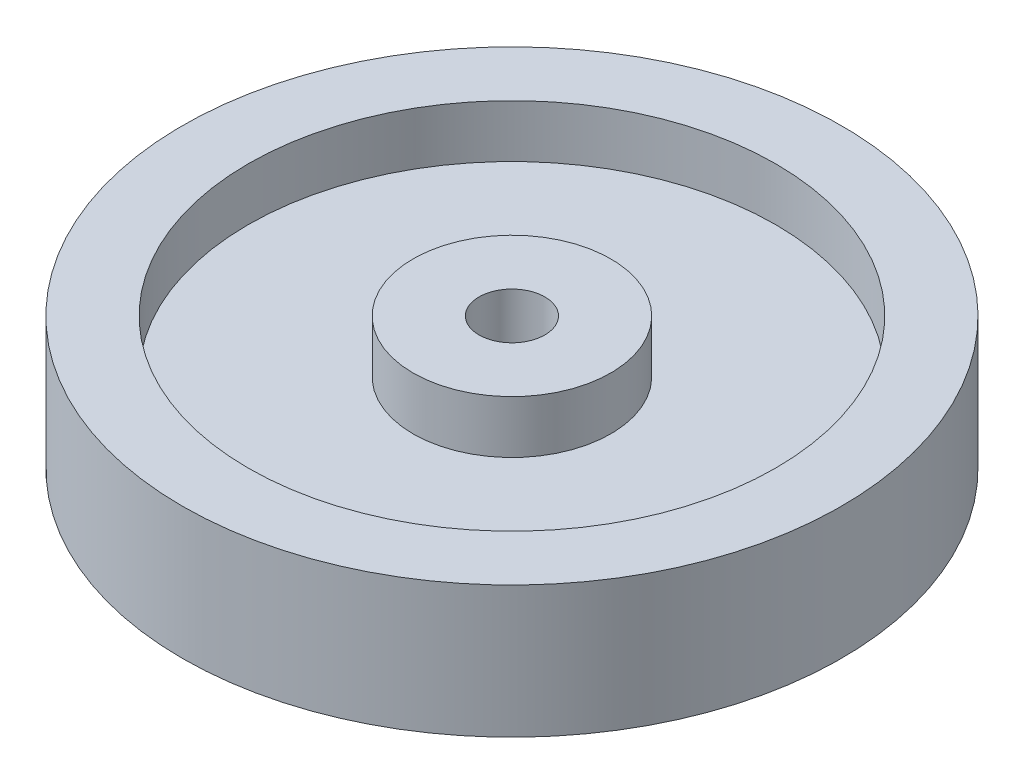
ISO-10303-21;
HEADER;
FILE_DESCRIPTION(('STEP AP214'),'2;1');
FILE_NAME('part.step','',(''),(''),'','','');
FILE_SCHEMA(('AUTOMOTIVE_DESIGN { 1 0 10303 214 1 1 1 1 }'));
ENDSEC;
DATA;
#1=APPLICATION_CONTEXT('core data for automotive mechanical design processes');
#2=APPLICATION_PROTOCOL_DEFINITION('international standard','automotive_design',2000,#1);
#3=PRODUCT_CONTEXT('',#1,'mechanical');
#4=PRODUCT('Part','Part','',(#3));
#5=PRODUCT_RELATED_PRODUCT_CATEGORY('part','',(#4));
#6=PRODUCT_DEFINITION_FORMATION('','',#4);
#7=PRODUCT_DEFINITION_CONTEXT('part definition',#1,'design');
#8=PRODUCT_DEFINITION('design','',#6,#7);
#9=PRODUCT_DEFINITION_SHAPE('','',#8);
#10=(LENGTH_UNIT() NAMED_UNIT(*) SI_UNIT(.MILLI.,.METRE.));
#11=(NAMED_UNIT(*) PLANE_ANGLE_UNIT() SI_UNIT($,.RADIAN.));
#12=(NAMED_UNIT(*) SI_UNIT($,.STERADIAN.) SOLID_ANGLE_UNIT());
#13=UNCERTAINTY_MEASURE_WITH_UNIT(LENGTH_MEASURE(1.E-05),#10,'distance_accuracy_value','');
#14=(GEOMETRIC_REPRESENTATION_CONTEXT(3) GLOBAL_UNCERTAINTY_ASSIGNED_CONTEXT((#13)) GLOBAL_UNIT_ASSIGNED_CONTEXT((#10,
#11,#12)) REPRESENTATION_CONTEXT('',''));
#15=CARTESIAN_POINT('',(0.,0.,0.));
#16=DIRECTION('',(0.,0.,1.));
#17=DIRECTION('',(1.,0.,0.));
#18=AXIS2_PLACEMENT_3D('',#15,#16,#17);
#19=CARTESIAN_POINT('',(0.,-5.,0.));
#20=DIRECTION('',(0.,1.,0.));
#21=DIRECTION('',(0.,0.,1.));
#22=AXIS2_PLACEMENT_3D('',#19,#20,#21);
#23=CYLINDRICAL_SURFACE('',#22,7.5);
#24=CARTESIAN_POINT('',(0.,-5.,0.));
#25=DIRECTION('',(0.,1.,0.));
#26=DIRECTION('',(0.,0.,1.));
#27=AXIS2_PLACEMENT_3D('',#24,#25,#26);
#28=CIRCLE('',#27,7.5);
#29=CARTESIAN_POINT('',(0.,-5.,7.5));
#30=VERTEX_POINT('',#29);
#31=EDGE_CURVE('E59',#30,#30,#28,.T.);
#32=ORIENTED_EDGE('',*,*,#31,.T.);
#33=EDGE_LOOP('',(#32));
#34=FACE_BOUND('',#33,.T.);
#35=CARTESIAN_POINT('',(0.,-1.,0.));
#36=DIRECTION('',(0.,1.,0.));
#37=DIRECTION('',(0.,0.,1.));
#38=AXIS2_PLACEMENT_3D('',#35,#36,#37);
#39=CIRCLE('',#38,7.5);
#40=CARTESIAN_POINT('',(0.,-1.,7.5));
#41=VERTEX_POINT('',#40);
#42=EDGE_CURVE('E83',#41,#41,#39,.T.);
#43=ORIENTED_EDGE('',*,*,#42,.F.);
#44=EDGE_LOOP('',(#43));
#45=FACE_BOUND('',#44,.T.);
#46=ADVANCED_FACE('F51',(#34,#45),#23,.T.);
#47=CARTESIAN_POINT('',(0.,-5.,0.));
#48=DIRECTION('',(0.,1.,0.));
#49=DIRECTION('',(0.,0.,1.));
#50=AXIS2_PLACEMENT_3D('',#47,#48,#49);
#51=CYLINDRICAL_SURFACE('',#50,2.5);
#52=CARTESIAN_POINT('',(0.,-5.,0.));
#53=DIRECTION('',(0.,1.,0.));
#54=DIRECTION('',(0.,0.,1.));
#55=AXIS2_PLACEMENT_3D('',#52,#53,#54);
#56=CIRCLE('',#55,2.5);
#57=CARTESIAN_POINT('',(0.,-5.,2.5));
#58=VERTEX_POINT('',#57);
#59=EDGE_CURVE('E64',#58,#58,#56,.T.);
#60=ORIENTED_EDGE('',*,*,#59,.F.);
#61=EDGE_LOOP('',(#60));
#62=FACE_BOUND('',#61,.T.);
#63=CARTESIAN_POINT('',(0.,5.,0.));
#64=DIRECTION('',(0.,1.,0.));
#65=DIRECTION('',(0.,0.,1.));
#66=AXIS2_PLACEMENT_3D('',#63,#64,#65);
#67=CIRCLE('',#66,2.5);
#68=CARTESIAN_POINT('',(0.,5.,2.5));
#69=VERTEX_POINT('',#68);
#70=EDGE_CURVE('E75',#69,#69,#67,.T.);
#71=ORIENTED_EDGE('',*,*,#70,.T.);
#72=EDGE_LOOP('',(#71));
#73=FACE_BOUND('',#72,.T.);
#74=ADVANCED_FACE('F53',(#62,#73),#51,.F.);
#75=CARTESIAN_POINT('',(0.,1.,0.));
#76=DIRECTION('',(0.,1.,0.));
#77=DIRECTION('',(0.,0.,1.));
#78=AXIS2_PLACEMENT_3D('',#75,#76,#77);
#79=CIRCLE('',#78,7.5);
#80=CARTESIAN_POINT('',(0.,1.,7.5));
#81=VERTEX_POINT('',#80);
#82=EDGE_CURVE('E11',#81,#81,#79,.F.);
#83=ORIENTED_EDGE('',*,*,#82,.F.);
#84=EDGE_LOOP('',(#83));
#85=FACE_BOUND('',#84,.T.);
#86=CARTESIAN_POINT('',(0.,5.,0.));
#87=DIRECTION('',(0.,1.,0.));
#88=DIRECTION('',(0.,0.,1.));
#89=AXIS2_PLACEMENT_3D('',#86,#87,#88);
#90=CIRCLE('',#89,7.5);
#91=CARTESIAN_POINT('',(0.,5.,7.5));
#92=VERTEX_POINT('',#91);
#93=EDGE_CURVE('E69',#92,#92,#90,.T.);
#94=ORIENTED_EDGE('',*,*,#93,.F.);
#95=EDGE_LOOP('',(#94));
#96=FACE_BOUND('',#95,.T.);
#97=ADVANCED_FACE('F131',(#85,#96),#23,.T.);
#98=CARTESIAN_POINT('',(0.,-5.,0.));
#99=DIRECTION('',(0.,1.,0.));
#100=DIRECTION('',(0.,0.,1.));
#101=AXIS2_PLACEMENT_3D('',#98,#99,#100);
#102=PLANE('',#101);
#103=ORIENTED_EDGE('',*,*,#59,.T.);
#104=EDGE_LOOP('',(#103));
#105=FACE_BOUND('',#104,.T.);
#106=ORIENTED_EDGE('',*,*,#31,.F.);
#107=EDGE_LOOP('',(#106));
#108=FACE_BOUND('',#107,.T.);
#109=ADVANCED_FACE('F139',(#105,#108),#102,.F.);
#110=CARTESIAN_POINT('',(0.,5.,0.));
#111=DIRECTION('',(0.,1.,0.));
#112=DIRECTION('',(0.,0.,1.));
#113=AXIS2_PLACEMENT_3D('',#110,#111,#112);
#114=PLANE('',#113);
#115=ORIENTED_EDGE('',*,*,#70,.F.);
#116=EDGE_LOOP('',(#115));
#117=FACE_BOUND('',#116,.T.);
#118=ORIENTED_EDGE('',*,*,#93,.T.);
#119=EDGE_LOOP('',(#118));
#120=FACE_BOUND('',#119,.T.);
#121=ADVANCED_FACE('F144',(#117,#120),#114,.T.);
#122=CARTESIAN_POINT('',(0.,-1.,0.));
#123=DIRECTION('',(0.,1.,0.));
#124=DIRECTION('',(0.,0.,1.));
#125=AXIS2_PLACEMENT_3D('',#122,#123,#124);
#126=PLANE('',#125);
#127=ORIENTED_EDGE('',*,*,#42,.T.);
#128=EDGE_LOOP('',(#127));
#129=FACE_BOUND('',#128,.T.);
#130=CARTESIAN_POINT('',(0.,-1.,0.));
#131=DIRECTION('',(0.,1.,0.));
#132=DIRECTION('',(0.,0.,1.));
#133=AXIS2_PLACEMENT_3D('',#130,#131,#132);
#134=CIRCLE('',#133,20.);
#135=CARTESIAN_POINT('',(0.,-1.,20.));
#136=VERTEX_POINT('',#135);
#137=EDGE_CURVE('E79',#136,#136,#134,.T.);
#138=ORIENTED_EDGE('',*,*,#137,.F.);
#139=EDGE_LOOP('',(#138));
#140=FACE_BOUND('',#139,.T.);
#141=ADVANCED_FACE('F150',(#129,#140),#126,.F.);
#142=CARTESIAN_POINT('',(0.,1.,0.));
#143=DIRECTION('',(0.,1.,0.));
#144=DIRECTION('',(0.,0.,1.));
#145=AXIS2_PLACEMENT_3D('',#142,#143,#144);
#146=PLANE('',#145);
#147=ORIENTED_EDGE('',*,*,#82,.T.);
#148=EDGE_LOOP('',(#147));
#149=FACE_BOUND('',#148,.T.);
#150=CARTESIAN_POINT('',(0.,1.,0.));
#151=DIRECTION('',(0.,1.,0.));
#152=DIRECTION('',(0.,0.,1.));
#153=AXIS2_PLACEMENT_3D('',#150,#151,#152);
#154=CIRCLE('',#153,20.);
#155=CARTESIAN_POINT('',(0.,1.,20.));
#156=VERTEX_POINT('',#155);
#157=EDGE_CURVE('E87',#156,#156,#154,.T.);
#158=ORIENTED_EDGE('',*,*,#157,.T.);
#159=EDGE_LOOP('',(#158));
#160=FACE_BOUND('',#159,.T.);
#161=ADVANCED_FACE('F156',(#149,#160),#146,.T.);
#162=CARTESIAN_POINT('',(0.,-5.,0.));
#163=DIRECTION('',(0.,1.,0.));
#164=DIRECTION('',(0.,0.,1.));
#165=AXIS2_PLACEMENT_3D('',#162,#163,#164);
#166=CYLINDRICAL_SURFACE('',#165,20.);
#167=CARTESIAN_POINT('',(0.,-5.,0.));
#168=DIRECTION('',(0.,1.,0.));
#169=DIRECTION('',(0.,0.,1.));
#170=AXIS2_PLACEMENT_3D('',#167,#168,#169);
#171=CIRCLE('',#170,20.);
#172=CARTESIAN_POINT('',(0.,-5.,20.));
#173=VERTEX_POINT('',#172);
#174=EDGE_CURVE('E95',#173,#173,#171,.T.);
#175=ORIENTED_EDGE('',*,*,#174,.F.);
#176=EDGE_LOOP('',(#175));
#177=FACE_BOUND('',#176,.T.);
#178=ORIENTED_EDGE('',*,*,#137,.T.);
#179=EDGE_LOOP('',(#178));
#180=FACE_BOUND('',#179,.T.);
#181=ADVANCED_FACE('F127',(#177,#180),#166,.F.);
#182=ORIENTED_EDGE('',*,*,#157,.F.);
#183=EDGE_LOOP('',(#182));
#184=FACE_BOUND('',#183,.T.);
#185=CARTESIAN_POINT('',(0.,5.,0.));
#186=DIRECTION('',(0.,1.,0.));
#187=DIRECTION('',(0.,0.,1.));
#188=AXIS2_PLACEMENT_3D('',#185,#186,#187);
#189=CIRCLE('',#188,20.);
#190=CARTESIAN_POINT('',(0.,5.,20.));
#191=VERTEX_POINT('',#190);
#192=EDGE_CURVE('E103',#191,#191,#189,.T.);
#193=ORIENTED_EDGE('',*,*,#192,.T.);
#194=EDGE_LOOP('',(#193));
#195=FACE_BOUND('',#194,.T.);
#196=ADVANCED_FACE('F108',(#184,#195),#166,.F.);
#197=CARTESIAN_POINT('',(0.,-5.,0.));
#198=DIRECTION('',(0.,1.,0.));
#199=DIRECTION('',(0.,0.,1.));
#200=AXIS2_PLACEMENT_3D('',#197,#198,#199);
#201=CYLINDRICAL_SURFACE('',#200,25.);
#202=CARTESIAN_POINT('',(0.,-5.,0.));
#203=DIRECTION('',(0.,1.,0.));
#204=DIRECTION('',(0.,0.,1.));
#205=AXIS2_PLACEMENT_3D('',#202,#203,#204);
#206=CIRCLE('',#205,25.);
#207=CARTESIAN_POINT('',(0.,-5.,25.));
#208=VERTEX_POINT('',#207);
#209=EDGE_CURVE('E91',#208,#208,#206,.T.);
#210=ORIENTED_EDGE('',*,*,#209,.T.);
#211=EDGE_LOOP('',(#210));
#212=FACE_BOUND('',#211,.T.);
#213=CARTESIAN_POINT('',(0.,5.,0.));
#214=DIRECTION('',(0.,1.,0.));
#215=DIRECTION('',(0.,0.,1.));
#216=AXIS2_PLACEMENT_3D('',#213,#214,#215);
#217=CIRCLE('',#216,25.);
#218=CARTESIAN_POINT('',(0.,5.,25.));
#219=VERTEX_POINT('',#218);
#220=EDGE_CURVE('E99',#219,#219,#217,.T.);
#221=ORIENTED_EDGE('',*,*,#220,.F.);
#222=EDGE_LOOP('',(#221));
#223=FACE_BOUND('',#222,.T.);
#224=ADVANCED_FACE('F117',(#212,#223),#201,.T.);
#225=CARTESIAN_POINT('',(0.,-5.,0.));
#226=DIRECTION('',(0.,1.,0.));
#227=DIRECTION('',(0.,0.,1.));
#228=AXIS2_PLACEMENT_3D('',#225,#226,#227);
#229=PLANE('',#228);
#230=ORIENTED_EDGE('',*,*,#174,.T.);
#231=EDGE_LOOP('',(#230));
#232=FACE_BOUND('',#231,.T.);
#233=ORIENTED_EDGE('',*,*,#209,.F.);
#234=EDGE_LOOP('',(#233));
#235=FACE_BOUND('',#234,.T.);
#236=ADVANCED_FACE('F113',(#232,#235),#229,.F.);
#237=CARTESIAN_POINT('',(0.,5.,0.));
#238=DIRECTION('',(0.,1.,0.));
#239=DIRECTION('',(0.,0.,1.));
#240=AXIS2_PLACEMENT_3D('',#237,#238,#239);
#241=PLANE('',#240);
#242=ORIENTED_EDGE('',*,*,#192,.F.);
#243=EDGE_LOOP('',(#242));
#244=FACE_BOUND('',#243,.T.);
#245=ORIENTED_EDGE('',*,*,#220,.T.);
#246=EDGE_LOOP('',(#245));
#247=FACE_BOUND('',#246,.T.);
#248=ADVANCED_FACE('F110',(#244,#247),#241,.T.);
#249=CLOSED_SHELL('',(#46,#74,#97,#109,#121,#141,#161,#181,#196,#224,#236,#248));
#250=MANIFOLD_SOLID_BREP('B2',#249);
#251=ADVANCED_BREP_SHAPE_REPRESENTATION('',(#18,#250),#14);
#252=SHAPE_DEFINITION_REPRESENTATION(#9,#251);
ENDSEC;
END-ISO-10303-21;
